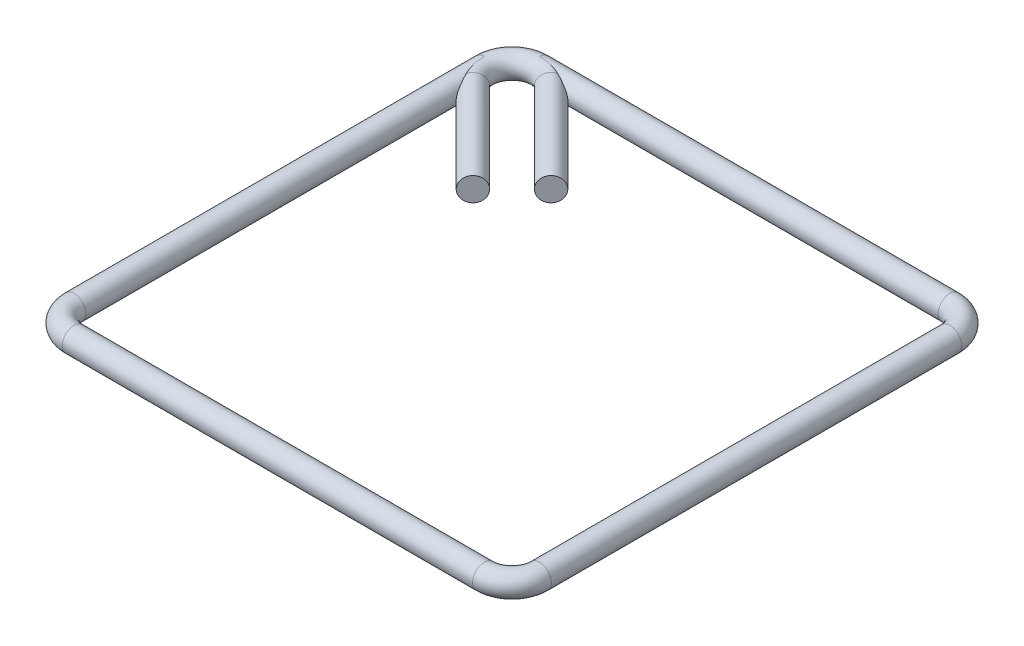
ISO-10303-21;
HEADER;
FILE_DESCRIPTION(('STEP AP214'),'2;1');
FILE_NAME('part.step','',(''),(''),'','','');
FILE_SCHEMA(('AUTOMOTIVE_DESIGN { 1 0 10303 214 1 1 1 1 }'));
ENDSEC;
DATA;
#1=APPLICATION_CONTEXT('core data for automotive mechanical design processes');
#2=APPLICATION_PROTOCOL_DEFINITION('international standard','automotive_design',2000,#1);
#3=PRODUCT_CONTEXT('',#1,'mechanical');
#4=PRODUCT('Part','Part','',(#3));
#5=PRODUCT_RELATED_PRODUCT_CATEGORY('part','',(#4));
#6=PRODUCT_DEFINITION_FORMATION('','',#4);
#7=PRODUCT_DEFINITION_CONTEXT('part definition',#1,'design');
#8=PRODUCT_DEFINITION('design','',#6,#7);
#9=PRODUCT_DEFINITION_SHAPE('','',#8);
#10=(LENGTH_UNIT() NAMED_UNIT(*) SI_UNIT(.MILLI.,.METRE.));
#11=(NAMED_UNIT(*) PLANE_ANGLE_UNIT() SI_UNIT($,.RADIAN.));
#12=(NAMED_UNIT(*) SI_UNIT($,.STERADIAN.) SOLID_ANGLE_UNIT());
#13=UNCERTAINTY_MEASURE_WITH_UNIT(LENGTH_MEASURE(1.E-05),#10,'distance_accuracy_value','');
#14=(GEOMETRIC_REPRESENTATION_CONTEXT(3) GLOBAL_UNCERTAINTY_ASSIGNED_CONTEXT((#13)) GLOBAL_UNIT_ASSIGNED_CONTEXT((#10,
#11,#12)) REPRESENTATION_CONTEXT('',''));
#15=CARTESIAN_POINT('',(0.,0.,0.));
#16=DIRECTION('',(0.,0.,1.));
#17=DIRECTION('',(1.,0.,0.));
#18=AXIS2_PLACEMENT_3D('',#15,#16,#17);
#19=CARTESIAN_POINT('',(82.55,0.,-93.6625000000002));
#20=DIRECTION('',(-1.,0.,0.));
#21=DIRECTION('',(0.,0.,1.));
#22=AXIS2_PLACEMENT_3D('',#19,#20,#21);
#23=CYLINDRICAL_SURFACE('',#22,4.7625);
#24=CARTESIAN_POINT('',(82.5500000000001,0.,-93.6625000000001));
#25=DIRECTION('',(-1.,0.,0.));
#26=DIRECTION('',(0.,0.,1.));
#27=AXIS2_PLACEMENT_3D('',#24,#25,#26);
#28=CIRCLE('',#27,4.7625);
#29=CARTESIAN_POINT('',(82.5500000000001,0.,-98.4249999999997));
#30=VERTEX_POINT('',#29);
#31=EDGE_CURVE('E129',#30,#30,#28,.T.);
#32=ORIENTED_EDGE('',*,*,#31,.T.);
#33=EDGE_LOOP('',(#32));
#34=FACE_BOUND('',#33,.T.);
#35=CARTESIAN_POINT('',(-82.5499999999998,0.,-93.6624999999998));
#36=DIRECTION('',(-1.,0.,0.));
#37=DIRECTION('',(0.,0.,1.));
#38=AXIS2_PLACEMENT_3D('',#35,#36,#37);
#39=CIRCLE('',#38,4.7625);
#40=CARTESIAN_POINT('',(-82.55,4.7625,-93.6624999999998));
#41=VERTEX_POINT('',#40);
#42=CARTESIAN_POINT('',(-82.55,-4.7625,-93.6624999999998));
#43=VERTEX_POINT('',#42);
#44=EDGE_CURVE('E128',#41,#43,#39,.T.);
#45=ORIENTED_EDGE('',*,*,#44,.F.);
#46=CARTESIAN_POINT('',(-82.55,-4.7625,-93.6624999999998));
#47=CARTESIAN_POINT('',(-82.500305891094,-4.76249999527232,-93.6624999987743));
#48=CARTESIAN_POINT('',(-82.4506121344912,-4.76250001228388,-93.662333326096));
#49=CARTESIAN_POINT('',(-82.3706700746024,-4.76249995029855,-93.6617970943645));
#50=CARTESIAN_POINT('',(-82.3404210745475,-4.76249990626255,-93.6615324349282));
#51=CARTESIAN_POINT('',(-82.189175196688,-4.7624994960055,-93.6599003482332));
#52=CARTESIAN_POINT('',(-82.0681870255752,-4.76249855954614,-93.657606613064));
#53=CARTESIAN_POINT('',(-81.8065910702931,-4.7624865043947,-93.6505116994516));
#54=CARTESIAN_POINT('',(-81.6659925898823,-4.76247375449215,-93.6453633939275));
#55=CARTESIAN_POINT('',(-81.4175219995943,-4.76241664216325,-93.6339093604121));
#56=CARTESIAN_POINT('',(-81.3096240803876,-4.76238029909576,-93.6281491625827));
#57=CARTESIAN_POINT('',(-80.9859757289322,-4.76221264099679,-93.6085154072059));
#58=CARTESIAN_POINT('',(-80.7703619210914,-4.76202267827783,-93.5922915685873));
#59=CARTESIAN_POINT('',(-80.3396710827301,-4.76129380621694,-93.5536326543536));
#60=CARTESIAN_POINT('',(-80.124594136722,-4.76075484503375,-93.5311966562493));
#61=CARTESIAN_POINT('',(-79.4775101654609,-4.7582319906362,-93.4543252752109));
#62=CARTESIAN_POINT('',(-79.0465820601726,-4.75533724710706,-93.3905052568657));
#63=CARTESIAN_POINT('',(-78.1889380454233,-4.74422012617472,-93.2387687175125));
#64=CARTESIAN_POINT('',(-77.7622236025843,-4.73599595584986,-93.1508440929968));
#65=CARTESIAN_POINT('',(-76.913344004038,-4.71024319040131,-92.9517848204706));
#66=CARTESIAN_POINT('',(-76.4911934533042,-4.69269060698223,-92.8405907834243));
#67=CARTESIAN_POINT('',(-75.6540882636017,-4.64336132350276,-92.5966170286781));
#68=CARTESIAN_POINT('',(-75.2391317403806,-4.61158840831892,-92.4638430606666));
#69=CARTESIAN_POINT('',(-74.488252304079,-4.53501456537747,-92.2029745989257));
#70=CARTESIAN_POINT('',(-74.15094236097,-4.49336820845702,-92.0779584540666));
#71=CARTESIAN_POINT('',(-73.4836314183799,-4.3921209618638,-91.815757934007));
#72=CARTESIAN_POINT('',(-73.1536330362945,-4.33251375057776,-91.6785692865117));
#73=CARTESIAN_POINT('',(-72.5044235695788,-4.19083218343894,-91.394584150825));
#74=CARTESIAN_POINT('',(-72.1851693649091,-4.10886387067685,-91.2478354387951));
#75=CARTESIAN_POINT('',(-71.7156468304569,-3.96465044429485,-91.0222601346104));
#76=CARTESIAN_POINT('',(-71.5607506483299,-3.91305715010653,-90.946186691361));
#77=CARTESIAN_POINT('',(-71.2545477317889,-3.80190589628274,-90.7926724057482));
#78=CARTESIAN_POINT('',(-71.103240195077,-3.74234973701405,-90.715231875902));
#79=CARTESIAN_POINT('',(-70.8382630916942,-3.62864784369857,-90.5769800328716));
#80=CARTESIAN_POINT('',(-70.723749808351,-3.57627506346664,-90.516326543758));
#81=CARTESIAN_POINT('',(-70.4976688807781,-3.46565789213524,-90.3948754200829));
#82=CARTESIAN_POINT('',(-70.3861010593512,-3.40741385526693,-90.3340777944334));
#83=CARTESIAN_POINT('',(-70.1662037248702,-3.28441006629745,-90.2126394113643));
#84=CARTESIAN_POINT('',(-70.0578800247056,-3.21963943142133,-90.1519990948526));
#85=CARTESIAN_POINT('',(-69.8452962252752,-3.08309886494107,-90.0314944137293));
#86=CARTESIAN_POINT('',(-69.7410356361666,-3.01132978073619,-89.9716299561657));
#87=CARTESIAN_POINT('',(-69.5361951525373,-2.85932512566272,-89.8526342856254));
#88=CARTESIAN_POINT('',(-69.4356681558026,-2.77900534450429,-89.7935183114843));
#89=CARTESIAN_POINT('',(-69.2405736730122,-2.60999263426869,-89.6775447271409));
#90=CARTESIAN_POINT('',(-69.146007342303,-2.52129809019595,-89.6206875555437));
#91=CARTESIAN_POINT('',(-68.8735292209761,-2.24207925866521,-89.4552273952313));
#92=CARTESIAN_POINT('',(-68.7059876587079,-2.03781358134223,-89.3512375635393));
#93=CARTESIAN_POINT('',(-68.4708833630565,-1.67873510488648,-89.203255202376));
#94=CARTESIAN_POINT('',(-68.389839579145,-1.53580301953983,-89.1516995643989));
#95=CARTESIAN_POINT('',(-68.2476875074294,-1.23650475805004,-89.060675414995));
#96=CARTESIAN_POINT('',(-68.1865656069949,-1.08014784778102,-89.0211986512034));
#97=CARTESIAN_POINT('',(-68.1128664475556,-0.837114875099236,-88.973406277199));
#98=CARTESIAN_POINT('',(-68.0912307285805,-0.754220705079503,-88.9593352105701));
#99=CARTESIAN_POINT('',(-68.0546078685643,-0.586388290662286,-88.9354796090174));
#100=CARTESIAN_POINT('',(-68.039617299593,-0.501451124050311,-88.9256928640399));
#101=CARTESIAN_POINT('',(-68.0166547315847,-0.330266801482071,-88.9106892019926));
#102=CARTESIAN_POINT('',(-68.0086794940132,-0.244020268702671,-88.9054701763016));
#103=CARTESIAN_POINT('',(-67.9999272883444,-0.0710354674607712,-88.8997417546696));
#104=CARTESIAN_POINT('',(-67.999149502386,0.015702744010456,-88.8992318236245));
#105=CARTESIAN_POINT('',(-68.0069877522362,0.253761493780213,-88.9043643246699));
#106=CARTESIAN_POINT('',(-68.0230718607208,0.404820191429699,-88.9148981722868));
#107=CARTESIAN_POINT('',(-68.0762083433688,0.701463121709799,-88.9495647228563));
#108=CARTESIAN_POINT('',(-68.1132691024168,0.847045140344521,-88.9737028637638));
#109=CARTESIAN_POINT('',(-68.2165048412402,1.1620882359231,-89.0405456784557));
#110=CARTESIAN_POINT('',(-68.2874102928988,1.32935902610198,-89.0862404783094));
#111=CARTESIAN_POINT('',(-68.4516134390073,1.64786206589914,-89.1910095232582));
#112=CARTESIAN_POINT('',(-68.5449476430557,1.79906757961455,-89.2501055740281));
#113=CARTESIAN_POINT('',(-68.7943117480656,2.14837489730955,-89.4060890344799));
#114=CARTESIAN_POINT('',(-68.959768750608,2.33744627344367,-89.5080983886777));
#115=CARTESIAN_POINT('',(-69.2261994305614,2.59671380771456,-89.6688978327015));
#116=CARTESIAN_POINT('',(-69.3181926908936,2.67917841956753,-89.7238779813387));
#117=CARTESIAN_POINT('',(-69.5073549545883,2.83658998028747,-89.8356906742678));
#118=CARTESIAN_POINT('',(-69.6045230368986,2.91153826016409,-89.8925228882214));
#119=CARTESIAN_POINT('',(-69.8719961024827,3.1039603784189,-90.0471219887276));
#120=CARTESIAN_POINT('',(-70.0463448206779,3.21493525835127,-90.1459781986711));
#121=CARTESIAN_POINT('',(-70.4044920859565,3.4195298980956,-90.3445871444421));
#122=CARTESIAN_POINT('',(-70.5882973386283,3.51313711974499,-90.4443404738729));
#123=CARTESIAN_POINT('',(-70.9636022624777,3.68542659184623,-90.6431675998933));
#124=CARTESIAN_POINT('',(-71.1551163170018,3.76407921135006,-90.7422396800977));
#125=CARTESIAN_POINT('',(-71.5439986276933,3.90825990023022,-90.9382198106925));
#126=CARTESIAN_POINT('',(-71.7413657720127,3.97379044416138,-91.03512826603));
#127=CARTESIAN_POINT('',(-72.1087211149481,4.08386146311286,-91.210481700675));
#128=CARTESIAN_POINT('',(-72.2779937583283,4.1300826958224,-91.2893846533131));
#129=CARTESIAN_POINT('',(-72.6194929822501,4.21546548303048,-91.4445968766262));
#130=CARTESIAN_POINT('',(-72.7917199150587,4.25462618913868,-91.5209058347149));
#131=CARTESIAN_POINT('',(-73.3124095207407,4.36280095178546,-91.7454545122642));
#132=CARTESIAN_POINT('',(-73.6647562465626,4.42247171339803,-91.8892561990775));
#133=CARTESIAN_POINT('',(-74.3774205836951,4.52253377298463,-92.1627479483125));
#134=CARTESIAN_POINT('',(-74.7377379372976,4.56292569333594,-92.2924384661796));
#135=CARTESIAN_POINT('',(-75.4647990336798,4.62910141852502,-92.5361115377069));
#136=CARTESIAN_POINT('',(-75.8315406037668,4.65489006752733,-92.6500992907474));
#137=CARTESIAN_POINT('',(-76.6079735597206,4.69791407236062,-92.8719030575841));
#138=CARTESIAN_POINT('',(-77.0182417437048,4.71401368845017,-92.9779142707182));
#139=CARTESIAN_POINT('',(-77.843654719589,4.73772867792216,-93.1680220191995));
#140=CARTESIAN_POINT('',(-78.2587944671639,4.74535215846986,-93.2521394361977));
#141=CARTESIAN_POINT('',(-78.935919548186,4.75373420329563,-93.3701731052679));
#142=CARTESIAN_POINT('',(-79.1966916226203,4.75599696650813,-93.4110638794286));
#143=CARTESIAN_POINT('',(-79.7195171979122,4.75928580672337,-93.4837980631965));
#144=CARTESIAN_POINT('',(-79.9815707549756,4.76031182898532,-93.5156410722829));
#145=CARTESIAN_POINT('',(-80.5685275524913,4.76184477901282,-93.5765379250514));
#146=CARTESIAN_POINT('',(-80.8936874317747,4.76217237622645,-93.6031656982489));
#147=CARTESIAN_POINT('',(-81.4143119786087,4.76242981055698,-93.6343398086095));
#148=CARTESIAN_POINT('',(-81.6095143969614,4.76246645501704,-93.6434589400036));
#149=CARTESIAN_POINT('',(-81.9177016597772,4.76249353359286,-93.6537923436856));
#150=CARTESIAN_POINT('',(-82.0306300019969,4.76249694080894,-93.6567184694617));
#151=CARTESIAN_POINT('',(-82.2293487434116,4.76249977238874,-93.6603524233543));
#152=CARTESIAN_POINT('',(-82.3151325570144,4.76249995767985,-93.6614245476677));
#153=CARTESIAN_POINT('',(-82.4506123246101,4.76249998306398,-93.6623333358621));
#154=CARTESIAN_POINT('',(-82.5003062093285,4.76249993559522,-93.6625000179901));
#155=CARTESIAN_POINT('',(-82.55,4.7625,-93.6624999999998));
#156=B_SPLINE_CURVE_WITH_KNOTS('',3,(#46,#47,#48,#49,#50,#51,#52,#53,#54,#55,#56,#57,#58,#59,
#60,#61,#62,#63,#64,#65,#66,#67,#68,#69,#70,#71,#72,#73,#74,#75,#76,#77,#78,#79,#80,#81,#82,#83,
#84,#85,#86,#87,#88,#89,#90,#91,#92,#93,#94,#95,#96,#97,#98,#99,#100,#101,#102,#103,#104,#105,
#106,#107,#108,#109,#110,#111,#112,#113,#114,#115,#116,#117,#118,#119,#120,#121,#122,#123,#124,
#125,#126,#127,#128,#129,#130,#131,#132,#133,#134,#135,#136,#137,#138,#139,#140,#141,#142,#143,
#144,#145,#146,#147,#148,#149,#150,#151,#152,#153,#154,#155),.UNSPECIFIED.,.F.,.F.,(4,2,2,2,2,2,
2,2,2,2,2,2,2,2,2,2,2,2,2,2,2,2,2,2,2,2,2,2,2,2,2,2,2,2,2,2,2,2,2,2,2,2,2,2,2,2,2,2,2,2,2,2,2,2,
4),(0.,0.149081353629526,0.239831656877043,0.602844209363337,1.02489503375005,1.34904128399791,
1.99760747550148,2.64627002905561,3.95239452808853,5.25895866079594,6.56889903633328,
7.87849096593093,8.96426826268893,10.0504281636103,11.1315241160379,11.671701604398,
12.211757167016,12.630926666833,13.0500708919696,13.4699259628915,13.8897302591186,
14.314137962125,14.7386276760354,15.5841688568137,16.0991920214241,16.6138625291339,
16.8739977155038,17.1339985533815,17.3938793022452,17.6537305199692,18.1081059882906,
18.5626632100876,19.1215697750931,19.6813923674665,20.4900599760168,20.8955350238593,
21.3009381419735,21.9871225544455,22.673800429946,23.3618250204552,24.0497197411675,
24.6267188276958,25.2037872000888,26.3583515871684,27.5128786990171,28.6670226090275,
29.9384710703623,31.2087023810384,32.0004614577338,32.7922555780846,33.7706596502083,
34.3568431843472,34.6957290862816,34.9530947627777,35.1021761164073),.UNSPECIFIED.);
#157=CARTESIAN_POINT('',(-73.344103576258,4.36420314066607,-91.7558964237418));
#158=VERTEX_POINT('',#157);
#159=EDGE_CURVE('E12',#41,#158,#156,.F.);
#160=ORIENTED_EDGE('',*,*,#159,.T.);
#161=CARTESIAN_POINT('',(-77.9470517881292,0.,-93.6624999999998));
#162=DIRECTION('',(-0.382683432365089,0.,0.923879532511287));
#163=DIRECTION('',(-0.923879532511287,0.,-0.382683432365089));
#164=AXIS2_PLACEMENT_3D('',#161,#162,#163);
#165=ELLIPSE('',#164,12.4450122404475,4.7625);
#166=CARTESIAN_POINT('',(-73.344103576258,-4.36420314066607,-91.7558964237418));
#167=VERTEX_POINT('',#166);
#168=EDGE_CURVE('E117',#158,#167,#165,.F.);
#169=ORIENTED_EDGE('',*,*,#168,.T.);
#170=EDGE_CURVE('E77',#167,#43,#156,.F.);
#171=ORIENTED_EDGE('',*,*,#170,.T.);
#172=EDGE_LOOP('',(#45,#160,#169,#171));
#173=FACE_BOUND('',#172,.T.);
#174=ADVANCED_FACE('F73',(#34,#173),#23,.T.);
#175=CARTESIAN_POINT('',(-93.6625000000002,0.,-82.55));
#176=DIRECTION('',(0.,0.,1.));
#177=DIRECTION('',(1.,0.,0.));
#178=AXIS2_PLACEMENT_3D('',#175,#176,#177);
#179=CYLINDRICAL_SURFACE('',#178,4.7625);
#180=CARTESIAN_POINT('',(-93.6624999999998,0.,82.5499999999999));
#181=DIRECTION('',(0.,0.,1.));
#182=DIRECTION('',(1.,0.,0.));
#183=AXIS2_PLACEMENT_3D('',#180,#181,#182);
#184=CIRCLE('',#183,4.7625);
#185=CARTESIAN_POINT('',(-98.425,0.,82.5499999999999));
#186=VERTEX_POINT('',#185);
#187=EDGE_CURVE('E148',#186,#186,#184,.T.);
#188=ORIENTED_EDGE('',*,*,#187,.F.);
#189=EDGE_LOOP('',(#188));
#190=FACE_BOUND('',#189,.T.);
#191=CARTESIAN_POINT('',(-93.6625000000002,0.,-82.55));
#192=DIRECTION('',(0.,0.,1.));
#193=DIRECTION('',(1.,0.,0.));
#194=AXIS2_PLACEMENT_3D('',#191,#192,#193);
#195=CIRCLE('',#194,4.7625);
#196=CARTESIAN_POINT('',(-93.6625000000002,4.7625,-82.55));
#197=VERTEX_POINT('',#196);
#198=CARTESIAN_POINT('',(-93.6625000000002,-4.7625,-82.55));
#199=VERTEX_POINT('',#198);
#200=EDGE_CURVE('E151',#197,#199,#195,.T.);
#201=ORIENTED_EDGE('',*,*,#200,.T.);
#202=CARTESIAN_POINT('',(-93.6625000000002,4.7625,-82.55));
#203=CARTESIAN_POINT('',(-93.6624999987751,4.76249999527232,-82.500305891094));
#204=CARTESIAN_POINT('',(-93.6623333260967,4.76250001228388,-82.4506121344912));
#205=CARTESIAN_POINT('',(-93.661797094365,4.76249995029855,-82.370670074602));
#206=CARTESIAN_POINT('',(-93.6615324349284,4.76249990626255,-82.3404210745466));
#207=CARTESIAN_POINT('',(-93.6599003482328,4.7624994960055,-82.189175196685));
#208=CARTESIAN_POINT('',(-93.6576066130639,4.76249855954614,-82.0681870255706));
#209=CARTESIAN_POINT('',(-93.6505116994517,4.7624865043947,-81.8065910702851));
#210=CARTESIAN_POINT('',(-93.6453633939274,4.76247375449215,-81.6659925898727));
#211=CARTESIAN_POINT('',(-93.6339093604117,4.76241664216324,-81.4175219995822));
#212=CARTESIAN_POINT('',(-93.6281491625821,4.76238029909575,-81.3096240803748));
#213=CARTESIAN_POINT('',(-93.6085154072049,4.76221264099678,-80.985975728917));
#214=CARTESIAN_POINT('',(-93.5922915685862,4.7620226782778,-80.7703619210746));
#215=CARTESIAN_POINT('',(-93.5536326543518,4.76129380621689,-80.3396710827101));
#216=CARTESIAN_POINT('',(-93.5311966562472,4.76075484503369,-80.1245941367004));
#217=CARTESIAN_POINT('',(-93.4543252752075,4.75823199063604,-79.4775101654344));
#218=CARTESIAN_POINT('',(-93.3905052568612,4.75533724710681,-79.046582060143));
#219=CARTESIAN_POINT('',(-93.2387687175057,4.7442201261741,-78.1889380453874));
#220=CARTESIAN_POINT('',(-93.1508440929886,4.73599595584897,-77.7622236025452));
#221=CARTESIAN_POINT('',(-92.9517848204594,4.71024319039961,-76.9133440039928));
#222=CARTESIAN_POINT('',(-92.8405907834114,4.69269060697996,-76.4911934532561));
#223=CARTESIAN_POINT('',(-92.5966170286616,4.64336132349896,-75.6540882635479));
#224=CARTESIAN_POINT('',(-92.4638430606482,4.61158840831413,-75.239131740324));
#225=CARTESIAN_POINT('',(-92.2029745989065,4.53501456537116,-74.4882523040258));
#226=CARTESIAN_POINT('',(-92.0779584540489,4.4933682084506,-74.1509423609228));
#227=CARTESIAN_POINT('',(-91.8157579339927,4.39212096185758,-73.4836314183446));
#228=CARTESIAN_POINT('',(-91.6785692864993,4.33251375057186,-73.153633036265));
#229=CARTESIAN_POINT('',(-91.3945841508168,4.1908321834343,-72.5044235695607));
#230=CARTESIAN_POINT('',(-91.2478354387893,4.10886387067314,-72.1851693648965));
#231=CARTESIAN_POINT('',(-91.0222601346083,3.96465044429321,-71.7156468304522));
#232=CARTESIAN_POINT('',(-90.9461866913602,3.91305715010569,-71.5607506483279));
#233=CARTESIAN_POINT('',(-90.79267240575,3.80190589628376,-71.254547731792));
#234=CARTESIAN_POINT('',(-90.715231875905,3.74234973701614,-71.1032401950825));
#235=CARTESIAN_POINT('',(-90.5769800328749,3.62864784370116,-70.8382630917001));
#236=CARTESIAN_POINT('',(-90.5163265437603,3.57627506346842,-70.723749808355));
#237=CARTESIAN_POINT('',(-90.3948754200831,3.4656578921352,-70.4976688807781));
#238=CARTESIAN_POINT('',(-90.3340777944326,3.40741385526588,-70.3861010593494));
#239=CARTESIAN_POINT('',(-90.2126394113614,3.28441006629416,-70.1662037248648));
#240=CARTESIAN_POINT('',(-90.1519990948487,3.2196394314168,-70.0578800246984));
#241=CARTESIAN_POINT('',(-90.0314944137234,3.0830988649338,-69.8452962252645));
#242=CARTESIAN_POINT('',(-89.9716299561588,3.01132978072741,-69.7410356361543));
#243=CARTESIAN_POINT('',(-89.8526342856166,2.85932512565057,-69.5361951525219));
#244=CARTESIAN_POINT('',(-89.7935183114744,2.77900534449027,-69.4356681557856));
#245=CARTESIAN_POINT('',(-89.6775447271293,2.60999263425059,-69.2405736729925));
#246=CARTESIAN_POINT('',(-89.6206875555312,2.52129809017562,-69.146007342282));
#247=CARTESIAN_POINT('',(-89.4552273952167,2.24207925863774,-68.8735292209521));
#248=CARTESIAN_POINT('',(-89.3512375635236,2.03781358130928,-68.7059876586825));
#249=CARTESIAN_POINT('',(-89.2032552023615,1.67873510484725,-68.4708833630334));
#250=CARTESIAN_POINT('',(-89.1516995643858,1.5358030195006,-68.3898395791243));
#251=CARTESIAN_POINT('',(-89.0606754149848,1.2365047580112,-68.2476875074134));
#252=CARTESIAN_POINT('',(-89.0211986511948,1.08014784774257,-68.1865656069813));
#253=CARTESIAN_POINT('',(-88.9734062771927,0.83711487506176,-68.1128664475455));
#254=CARTESIAN_POINT('',(-88.9593352105645,0.754220705042441,-68.0912307285716));
#255=CARTESIAN_POINT('',(-88.9354796090133,0.586388290626183,-68.0546078685576));
#256=CARTESIAN_POINT('',(-88.9256928640365,0.501451124014755,-68.0396172995875));
#257=CARTESIAN_POINT('',(-88.9106892019906,0.330266801447735,-68.0166547315813));
#258=CARTESIAN_POINT('',(-88.9054701763002,0.244020268669008,-68.0086794940108));
#259=CARTESIAN_POINT('',(-88.8997417546694,0.0710354674285703,-67.9999272883438));
#260=CARTESIAN_POINT('',(-88.8992318236249,-0.0157027440418673,-67.9991495023863));
#261=CARTESIAN_POINT('',(-88.9043643246718,-0.253761493810099,-68.0069877522388));
#262=CARTESIAN_POINT('',(-88.9148981722896,-0.404820191458744,-68.0230718607248));
#263=CARTESIAN_POINT('',(-88.9495647228606,-0.701463121736963,-68.0762083433753));
#264=CARTESIAN_POINT('',(-88.9737028637689,-0.847045140370645,-68.1132691024243));
#265=CARTESIAN_POINT('',(-89.0405456784624,-1.16208823594888,-68.2165048412504));
#266=CARTESIAN_POINT('',(-89.0862404783174,-1.32935902612829,-68.2874102929109));
#267=CARTESIAN_POINT('',(-89.1910095232685,-1.64786206592616,-68.4516134390231));
#268=CARTESIAN_POINT('',(-89.2501055740394,-1.79906757964175,-68.5449476430735));
#269=CARTESIAN_POINT('',(-89.4060890344944,-2.14837489733782,-68.7943117480886));
#270=CARTESIAN_POINT('',(-89.5080983886941,-2.33744627347256,-68.9597687506347));
#271=CARTESIAN_POINT('',(-89.6688978327208,-2.59671380774392,-69.2261994305934));
#272=CARTESIAN_POINT('',(-89.723877981359,-2.67917841959698,-69.3181926909275));
#273=CARTESIAN_POINT('',(-89.8356906742899,-2.83658998031699,-69.5073549546257));
#274=CARTESIAN_POINT('',(-89.8925228882445,-2.9115382601936,-69.6045230369379));
#275=CARTESIAN_POINT('',(-90.0471219887534,-3.1039603784487,-69.8719961025275));
#276=CARTESIAN_POINT('',(-90.1459781986987,-3.21493525838121,-70.0463448207266));
#277=CARTESIAN_POINT('',(-90.3445871444731,-3.41952989812549,-70.404492086013));
#278=CARTESIAN_POINT('',(-90.4443404739056,-3.5131371197747,-70.5882973386886));
#279=CARTESIAN_POINT('',(-90.6431675999291,-3.68542659187532,-70.9636022625459));
#280=CARTESIAN_POINT('',(-90.7422396801349,-3.76407921137872,-71.155116317074));
#281=CARTESIAN_POINT('',(-90.9382198107324,-3.90825990025783,-71.5439986277735));
#282=CARTESIAN_POINT('',(-91.0351282660711,-3.97379044418838,-71.7413657720969));
#283=CARTESIAN_POINT('',(-91.2104817007158,-4.08386146313715,-72.1087211150347));
#284=CARTESIAN_POINT('',(-91.2893846533525,-4.13008269584483,-72.2779937584133));
#285=CARTESIAN_POINT('',(-91.4445968766628,-4.21546548304954,-72.6194929823317));
#286=CARTESIAN_POINT('',(-91.5209058347501,-4.2546261891562,-72.7917199151385));
#287=CARTESIAN_POINT('',(-91.7454545122953,-4.36280095179881,-73.3124095208151));
#288=CARTESIAN_POINT('',(-91.8892561991058,-4.42247171340914,-73.6647562466331));
#289=CARTESIAN_POINT('',(-92.1627479483355,-4.52253377299206,-74.3774205837575));
#290=CARTESIAN_POINT('',(-92.2924384662001,-4.56292569334193,-74.7377379373556));
#291=CARTESIAN_POINT('',(-92.5361115377228,-4.62910141852872,-75.4647990337291));
#292=CARTESIAN_POINT('',(-92.6500992907611,-4.65489006753018,-75.8315406038117));
#293=CARTESIAN_POINT('',(-92.8719030575944,-4.69791407236225,-76.6079735597587));
#294=CARTESIAN_POINT('',(-92.9779142707272,-4.7140136884514,-77.0182417437405));
#295=CARTESIAN_POINT('',(-93.1680220192061,-4.7377286779228,-77.8436547196198));
#296=CARTESIAN_POINT('',(-93.2521394362033,-4.7453521584703,-78.2587944671922));
#297=CARTESIAN_POINT('',(-93.3701731052721,-4.75373420329586,-78.9359195482105));
#298=CARTESIAN_POINT('',(-93.4110638794321,-4.7559969665083,-79.1966916226433));
#299=CARTESIAN_POINT('',(-93.4837980631992,-4.75928580672346,-79.7195171979323));
#300=CARTESIAN_POINT('',(-93.5156410722852,-4.76031182898538,-79.9815707549941));
#301=CARTESIAN_POINT('',(-93.5765379250528,-4.76184477901284,-80.5685275525067));
#302=CARTESIAN_POINT('',(-93.60316569825,-4.76217237622646,-80.8936874317883));
#303=CARTESIAN_POINT('',(-93.6343398086103,-4.76242981055698,-81.4143119786197));
#304=CARTESIAN_POINT('',(-93.6434589400045,-4.76246645501704,-81.6095143969716));
#305=CARTESIAN_POINT('',(-93.653792343686,-4.76249353359286,-81.9177016597868));
#306=CARTESIAN_POINT('',(-93.6567184694619,-4.76249694080894,-82.0306300020067));
#307=CARTESIAN_POINT('',(-93.660352423354,-4.76249977238874,-82.2293487434182));
#308=CARTESIAN_POINT('',(-93.6614245476673,-4.76249995767985,-82.3151325570177));
#309=CARTESIAN_POINT('',(-93.6623333358619,-4.76249998306398,-82.4506123246102));
#310=CARTESIAN_POINT('',(-93.6625000179901,-4.76249993559522,-82.5003062093285));
#311=CARTESIAN_POINT('',(-93.6625000000002,-4.7625,-82.55));
#312=B_SPLINE_CURVE_WITH_KNOTS('',3,(#202,#203,#204,#205,#206,#207,#208,#209,#210,#211,#212,
#213,#214,#215,#216,#217,#218,#219,#220,#221,#222,#223,#224,#225,#226,#227,#228,#229,#230,#231,
#232,#233,#234,#235,#236,#237,#238,#239,#240,#241,#242,#243,#244,#245,#246,#247,#248,#249,#250,
#251,#252,#253,#254,#255,#256,#257,#258,#259,#260,#261,#262,#263,#264,#265,#266,#267,#268,#269,
#270,#271,#272,#273,#274,#275,#276,#277,#278,#279,#280,#281,#282,#283,#284,#285,#286,#287,#288,
#289,#290,#291,#292,#293,#294,#295,#296,#297,#298,#299,#300,#301,#302,#303,#304,#305,#306,#307,
#308,#309,#310,#311),.UNSPECIFIED.,.F.,.F.,(4,2,2,2,2,2,2,2,2,2,2,2,2,2,2,2,2,2,2,2,2,2,2,2,2,2,
2,2,2,2,2,2,2,2,2,2,2,2,2,2,2,2,2,2,2,2,2,2,2,2,2,2,2,2,4),(0.,0.149081353629526,
0.239831656878323,0.60284420936971,1.02489503376134,1.3490412840116,1.99760747552,
2.64627002907895,3.95239452812183,5.25895866083918,6.56889903638641,7.87849096599394,
8.96426826273368,10.0504281636368,11.1315241160463,11.6717016043974,12.2117571670064,
12.6309266668305,13.0500708919743,13.4699259629033,13.8897302591376,14.3141379621517,
14.7386276760697,15.5841688568628,16.0991920214685,16.6138625291737,16.8739977155413,
17.1339985534165,17.3938793022778,17.6537305199994,18.108105988319,18.5626632101141,
19.121569775124,19.6813923675018,20.4900599760621,20.8955350239096,21.3009381420288,
21.9871225545122,22.6738004300239,23.3618250205444,24.049719741268,24.626718827789,
25.2037872001747,26.3583515872396,27.5128786990734,28.667022609069,29.9384710703959,
31.2087023810642,32.000461457755,32.7922555781012,33.7706596502195,34.3568431843561,
34.695729086291,34.9530947627772,35.1021761164068),.UNSPECIFIED.);
#313=CARTESIAN_POINT('',(-91.7558964237419,-4.364203140666,-73.344103576258));
#314=VERTEX_POINT('',#313);
#315=EDGE_CURVE('E154',#199,#314,#312,.F.);
#316=ORIENTED_EDGE('',*,*,#315,.T.);
#317=CARTESIAN_POINT('',(-93.6625000000002,0.,-77.9470517881296));
#318=DIRECTION('',(-0.923879532511286,0.,0.382683432365091));
#319=DIRECTION('',(0.382683432365091,0.,0.923879532511286));
#320=AXIS2_PLACEMENT_3D('',#317,#318,#319);
#321=ELLIPSE('',#320,12.4450122404475,4.7625);
#322=CARTESIAN_POINT('',(-91.7558964237419,4.364203140666,-73.344103576258));
#323=VERTEX_POINT('',#322);
#324=EDGE_CURVE('E121',#314,#323,#321,.T.);
#325=ORIENTED_EDGE('',*,*,#324,.T.);
#326=EDGE_CURVE('E155',#323,#197,#312,.F.);
#327=ORIENTED_EDGE('',*,*,#326,.T.);
#328=EDGE_LOOP('',(#201,#316,#325,#327));
#329=FACE_BOUND('',#328,.T.);
#330=ADVANCED_FACE('F169',(#190,#329),#179,.T.);
#331=CARTESIAN_POINT('',(-82.5500000000001,0.,82.5499999999999));
#332=DIRECTION('',(0.,1.,0.));
#333=DIRECTION('',(0.,0.,1.));
#334=AXIS2_PLACEMENT_3D('',#331,#332,#333);
#335=TOROIDAL_SURFACE('',#334,11.1124999999999,4.7625);
#336=CARTESIAN_POINT('',(-82.5500000000002,0.,93.6625));
#337=DIRECTION('',(1.,0.,0.));
#338=DIRECTION('',(0.,0.,-1.));
#339=AXIS2_PLACEMENT_3D('',#336,#337,#338);
#340=CIRCLE('',#339,4.7625);
#341=CARTESIAN_POINT('',(-82.5500000000002,0.,98.4249999999998));
#342=VERTEX_POINT('',#341);
#343=EDGE_CURVE('E145',#342,#342,#340,.T.);
#344=CARTESIAN_POINT('',(-82.5500000000001,0.,82.5499999999999));
#345=DIRECTION('',(0.,1.,0.));
#346=DIRECTION('',(0.,0.,1.));
#347=AXIS2_PLACEMENT_3D('',#344,#345,#346);
#348=CIRCLE('',#347,15.8749999999999);
#349=EDGE_CURVE('',#186,#342,#348,.T.);
#350=ORIENTED_EDGE('',*,*,#187,.T.);
#351=ORIENTED_EDGE('',*,*,#343,.F.);
#352=ORIENTED_EDGE('',*,*,#349,.T.);
#353=ORIENTED_EDGE('',*,*,#349,.F.);
#354=EDGE_LOOP('',(#350,#352,#351,#353));
#355=FACE_BOUND('',#354,.T.);
#356=ADVANCED_FACE('F174',(#355),#335,.T.);
#357=CARTESIAN_POINT('',(-82.55,0.,93.6625000000002));
#358=DIRECTION('',(1.,0.,0.));
#359=DIRECTION('',(0.,0.,-1.));
#360=AXIS2_PLACEMENT_3D('',#357,#358,#359);
#361=CYLINDRICAL_SURFACE('',#360,4.7625);
#362=CARTESIAN_POINT('',(82.5499999999998,0.,93.6624999999998));
#363=DIRECTION('',(1.,0.,0.));
#364=DIRECTION('',(0.,0.,-1.));
#365=AXIS2_PLACEMENT_3D('',#362,#363,#364);
#366=CIRCLE('',#365,4.7625);
#367=CARTESIAN_POINT('',(82.5499999999998,0.,98.425));
#368=VERTEX_POINT('',#367);
#369=EDGE_CURVE('E142',#368,#368,#366,.T.);
#370=ORIENTED_EDGE('',*,*,#369,.F.);
#371=EDGE_LOOP('',(#370));
#372=FACE_BOUND('',#371,.T.);
#373=ORIENTED_EDGE('',*,*,#343,.T.);
#374=EDGE_LOOP('',(#373));
#375=FACE_BOUND('',#374,.T.);
#376=ADVANCED_FACE('F180',(#372,#375),#361,.T.);
#377=CARTESIAN_POINT('',(82.5499999999998,0.,82.5500000000002));
#378=DIRECTION('',(0.,1.,0.));
#379=DIRECTION('',(0.,0.,1.));
#380=AXIS2_PLACEMENT_3D('',#377,#378,#379);
#381=TOROIDAL_SURFACE('',#380,11.1124999999999,4.7625);
#382=CARTESIAN_POINT('',(93.6625000000002,0.,82.5499999999999));
#383=DIRECTION('',(0.,0.,-1.));
#384=DIRECTION('',(-1.,0.,0.));
#385=AXIS2_PLACEMENT_3D('',#382,#383,#384);
#386=CIRCLE('',#385,4.7625);
#387=CARTESIAN_POINT('',(98.4249999999997,0.,82.5499999999999));
#388=VERTEX_POINT('',#387);
#389=EDGE_CURVE('E139',#388,#388,#386,.T.);
#390=CARTESIAN_POINT('',(82.5499999999998,0.,82.5500000000002));
#391=DIRECTION('',(0.,1.,0.));
#392=DIRECTION('',(0.,0.,1.));
#393=AXIS2_PLACEMENT_3D('',#390,#391,#392);
#394=CIRCLE('',#393,15.8749999999999);
#395=EDGE_CURVE('',#368,#388,#394,.T.);
#396=ORIENTED_EDGE('',*,*,#369,.T.);
#397=ORIENTED_EDGE('',*,*,#389,.F.);
#398=ORIENTED_EDGE('',*,*,#395,.T.);
#399=ORIENTED_EDGE('',*,*,#395,.F.);
#400=EDGE_LOOP('',(#396,#398,#397,#399));
#401=FACE_BOUND('',#400,.T.);
#402=ADVANCED_FACE('F184',(#401),#381,.T.);
#403=CARTESIAN_POINT('',(93.6625000000002,0.,82.55));
#404=DIRECTION('',(0.,0.,-1.));
#405=DIRECTION('',(-1.,0.,0.));
#406=AXIS2_PLACEMENT_3D('',#403,#404,#405);
#407=CYLINDRICAL_SURFACE('',#406,4.7625);
#408=CARTESIAN_POINT('',(93.6624999999997,0.,-82.5499999999998));
#409=DIRECTION('',(0.,0.,-1.));
#410=DIRECTION('',(-1.,0.,0.));
#411=AXIS2_PLACEMENT_3D('',#408,#409,#410);
#412=CIRCLE('',#411,4.7625);
#413=CARTESIAN_POINT('',(98.4250000000001,0.,-82.5499999999998));
#414=VERTEX_POINT('',#413);
#415=EDGE_CURVE('E134',#414,#414,#412,.T.);
#416=ORIENTED_EDGE('',*,*,#415,.F.);
#417=EDGE_LOOP('',(#416));
#418=FACE_BOUND('',#417,.T.);
#419=ORIENTED_EDGE('',*,*,#389,.T.);
#420=EDGE_LOOP('',(#419));
#421=FACE_BOUND('',#420,.T.);
#422=ADVANCED_FACE('F188',(#418,#421),#407,.T.);
#423=CARTESIAN_POINT('',(82.5500000000001,0.,-82.5499999999998));
#424=DIRECTION('',(0.,1.,0.));
#425=DIRECTION('',(0.,0.,1.));
#426=AXIS2_PLACEMENT_3D('',#423,#424,#425);
#427=TOROIDAL_SURFACE('',#426,11.1125,4.7625);
#428=CARTESIAN_POINT('',(82.5500000000001,0.,-82.5499999999998));
#429=DIRECTION('',(0.,1.,0.));
#430=DIRECTION('',(0.,0.,1.));
#431=AXIS2_PLACEMENT_3D('',#428,#429,#430);
#432=CIRCLE('',#431,15.875);
#433=EDGE_CURVE('',#414,#30,#432,.T.);
#434=ORIENTED_EDGE('',*,*,#415,.T.);
#435=ORIENTED_EDGE('',*,*,#31,.F.);
#436=ORIENTED_EDGE('',*,*,#433,.T.);
#437=ORIENTED_EDGE('',*,*,#433,.F.);
#438=EDGE_LOOP('',(#434,#436,#435,#437));
#439=FACE_BOUND('',#438,.T.);
#440=ADVANCED_FACE('F176',(#439),#427,.T.);
#441=CARTESIAN_POINT('',(-82.5499999999998,0.,-82.5500000000001));
#442=DIRECTION('',(0.,1.,0.));
#443=DIRECTION('',(0.,0.,1.));
#444=AXIS2_PLACEMENT_3D('',#441,#442,#443);
#445=TOROIDAL_SURFACE('',#444,11.1124999999998,4.7625);
#446=ORIENTED_EDGE('',*,*,#315,.F.);
#447=ORIENTED_EDGE('',*,*,#200,.F.);
#448=ORIENTED_EDGE('',*,*,#326,.F.);
#449=CARTESIAN_POINT('',(-90.4077241059351,0.,-74.6922758940648));
#450=DIRECTION('',(-0.707106781186548,0.,-0.707106781186547));
#451=DIRECTION('',(-0.707106781186547,0.,0.707106781186548));
#452=AXIS2_PLACEMENT_3D('',#449,#450,#451);
#453=CIRCLE('',#452,4.7625);
#454=EDGE_CURVE('E99',#323,#314,#453,.T.);
#455=ORIENTED_EDGE('',*,*,#454,.T.);
#456=EDGE_LOOP('',(#446,#447,#448,#455));
#457=FACE_BOUND('',#456,.T.);
#458=ORIENTED_EDGE('',*,*,#44,.T.);
#459=ORIENTED_EDGE('',*,*,#170,.F.);
#460=CARTESIAN_POINT('',(-74.6922758940648,0.,-90.4077241059351));
#461=DIRECTION('',(0.707106781186547,0.,0.707106781186548));
#462=DIRECTION('',(0.707106781186548,0.,-0.707106781186547));
#463=AXIS2_PLACEMENT_3D('',#460,#461,#462);
#464=CIRCLE('',#463,4.7625);
#465=EDGE_CURVE('E92',#167,#158,#464,.F.);
#466=ORIENTED_EDGE('',*,*,#465,.T.);
#467=ORIENTED_EDGE('',*,*,#159,.F.);
#468=EDGE_LOOP('',(#458,#459,#466,#467));
#469=FACE_BOUND('',#468,.T.);
#470=ADVANCED_FACE('F124',(#457,#469),#445,.T.);
#471=CARTESIAN_POINT('',(-54.4866996216586,0.,-38.771251409788));
#472=DIRECTION('',(-0.707106781186548,0.,-0.707106781186547));
#473=DIRECTION('',(-0.707106781186547,0.,0.707106781186548));
#474=AXIS2_PLACEMENT_3D('',#471,#472,#473);
#475=PLANE('',#474);
#476=CARTESIAN_POINT('',(-54.4866996216586,0.,-38.771251409788));
#477=DIRECTION('',(-0.707106781186548,0.,-0.707106781186547));
#478=DIRECTION('',(-0.707106781186547,0.,0.707106781186548));
#479=AXIS2_PLACEMENT_3D('',#476,#477,#478);
#480=CIRCLE('',#479,4.7625);
#481=CARTESIAN_POINT('',(-57.8542956670595,0.,-35.4036553643871));
#482=VERTEX_POINT('',#481);
#483=EDGE_CURVE('E164',#482,#482,#480,.T.);
#484=ORIENTED_EDGE('',*,*,#483,.F.);
#485=EDGE_LOOP('',(#484));
#486=FACE_BOUND('',#485,.T.);
#487=ADVANCED_FACE('F177',(#486),#475,.F.);
#488=CARTESIAN_POINT('',(-90.4077241059352,0.,-74.6922758940647));
#489=DIRECTION('',(0.707106781186548,0.,0.707106781186547));
#490=DIRECTION('',(0.707106781186547,0.,-0.707106781186548));
#491=AXIS2_PLACEMENT_3D('',#488,#489,#490);
#492=CYLINDRICAL_SURFACE('',#491,4.7625);
#493=ORIENTED_EDGE('',*,*,#324,.F.);
#494=ORIENTED_EDGE('',*,*,#454,.F.);
#495=EDGE_LOOP('',(#493,#494));
#496=FACE_BOUND('',#495,.T.);
#497=ORIENTED_EDGE('',*,*,#483,.T.);
#498=EDGE_LOOP('',(#497));
#499=FACE_BOUND('',#498,.T.);
#500=ADVANCED_FACE('F198',(#496,#499),#492,.T.);
#501=CARTESIAN_POINT('',(-38.771251409788,0.,-54.4866996216586));
#502=DIRECTION('',(-0.707106781186547,0.,-0.707106781186548));
#503=DIRECTION('',(0.707106781186548,0.,-0.707106781186547));
#504=AXIS2_PLACEMENT_3D('',#501,#502,#503);
#505=PLANE('',#504);
#506=CARTESIAN_POINT('',(-38.771251409788,0.,-54.4866996216586));
#507=DIRECTION('',(0.707106781186547,0.,0.707106781186548));
#508=DIRECTION('',(0.707106781186548,0.,-0.707106781186547));
#509=AXIS2_PLACEMENT_3D('',#506,#507,#508);
#510=CIRCLE('',#509,4.7625);
#511=CARTESIAN_POINT('',(-35.4036553643871,0.,-57.8542956670595));
#512=VERTEX_POINT('',#511);
#513=EDGE_CURVE('E126',#512,#512,#510,.F.);
#514=ORIENTED_EDGE('',*,*,#513,.F.);
#515=EDGE_LOOP('',(#514));
#516=FACE_BOUND('',#515,.T.);
#517=ADVANCED_FACE('F266',(#516),#505,.F.);
#518=CARTESIAN_POINT('',(-74.6922758940646,0.,-90.4077241059352));
#519=DIRECTION('',(0.707106781186547,0.,0.707106781186548));
#520=DIRECTION('',(0.707106781186548,0.,-0.707106781186547));
#521=AXIS2_PLACEMENT_3D('',#518,#519,#520);
#522=CYLINDRICAL_SURFACE('',#521,4.7625);
#523=ORIENTED_EDGE('',*,*,#168,.F.);
#524=ORIENTED_EDGE('',*,*,#465,.F.);
#525=EDGE_LOOP('',(#523,#524));
#526=FACE_BOUND('',#525,.T.);
#527=ORIENTED_EDGE('',*,*,#513,.T.);
#528=EDGE_LOOP('',(#527));
#529=FACE_BOUND('',#528,.T.);
#530=ADVANCED_FACE('F118',(#526,#529),#522,.T.);
#531=CLOSED_SHELL('',(#174,#330,#356,#376,#402,#422,#440,#470,#487,#500,#517,#530));
#532=MANIFOLD_SOLID_BREP('B2',#531);
#533=ADVANCED_BREP_SHAPE_REPRESENTATION('',(#18,#532),#14);
#534=SHAPE_DEFINITION_REPRESENTATION(#9,#533);
ENDSEC;
END-ISO-10303-21;
